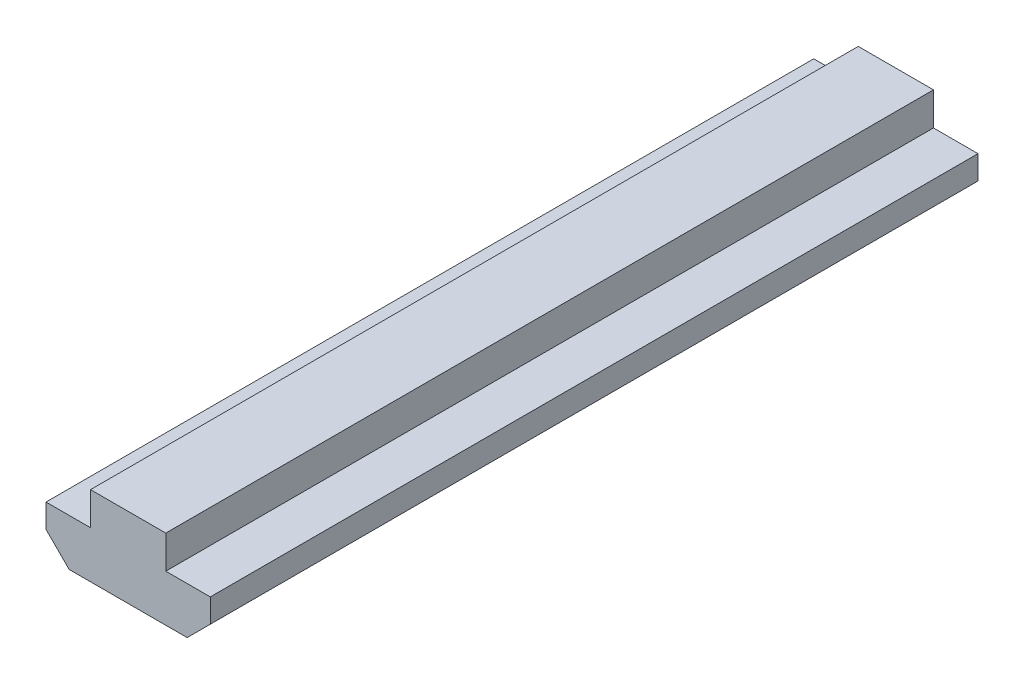
ISO-10303-21;
HEADER;
FILE_DESCRIPTION(('STEP AP214'),'2;1');
FILE_NAME('part.step','',(''),(''),'','','');
FILE_SCHEMA(('AUTOMOTIVE_DESIGN { 1 0 10303 214 1 1 1 1 }'));
ENDSEC;
DATA;
#1=APPLICATION_CONTEXT('core data for automotive mechanical design processes');
#2=APPLICATION_PROTOCOL_DEFINITION('international standard','automotive_design',2000,#1);
#3=PRODUCT_CONTEXT('',#1,'mechanical');
#4=PRODUCT('Part','Part','',(#3));
#5=PRODUCT_RELATED_PRODUCT_CATEGORY('part','',(#4));
#6=PRODUCT_DEFINITION_FORMATION('','',#4);
#7=PRODUCT_DEFINITION_CONTEXT('part definition',#1,'design');
#8=PRODUCT_DEFINITION('design','',#6,#7);
#9=PRODUCT_DEFINITION_SHAPE('','',#8);
#10=(LENGTH_UNIT() NAMED_UNIT(*) SI_UNIT(.MILLI.,.METRE.));
#11=(NAMED_UNIT(*) PLANE_ANGLE_UNIT() SI_UNIT($,.RADIAN.));
#12=(NAMED_UNIT(*) SI_UNIT($,.STERADIAN.) SOLID_ANGLE_UNIT());
#13=UNCERTAINTY_MEASURE_WITH_UNIT(LENGTH_MEASURE(1.E-05),#10,'distance_accuracy_value','');
#14=(GEOMETRIC_REPRESENTATION_CONTEXT(3) GLOBAL_UNCERTAINTY_ASSIGNED_CONTEXT((#13)) GLOBAL_UNIT_ASSIGNED_CONTEXT((#10,
#11,#12)) REPRESENTATION_CONTEXT('',''));
#15=CARTESIAN_POINT('',(0.,0.,0.));
#16=DIRECTION('',(0.,0.,1.));
#17=DIRECTION('',(1.,0.,0.));
#18=AXIS2_PLACEMENT_3D('',#15,#16,#17);
#19=CARTESIAN_POINT('',(5.79999999999973,4.29999999999995,100.));
#20=DIRECTION('',(0.,-1.,0.));
#21=DIRECTION('',(0.,0.,-1.));
#22=AXIS2_PLACEMENT_3D('',#19,#20,#21);
#23=PLANE('',#22);
#24=DIRECTION('',(-1.,0.,0.));
#25=VECTOR('',#24,1.);
#26=CARTESIAN_POINT('',(5.79999999999973,4.29999999999995,0.));
#27=LINE('',#26,#25);
#28=CARTESIAN_POINT('',(15.5999999999999,4.29999999999995,0.));
#29=VERTEX_POINT('',#28);
#30=CARTESIAN_POINT('',(5.79999999999973,4.29999999999995,0.));
#31=VERTEX_POINT('',#30);
#32=EDGE_CURVE('E143',#29,#31,#27,.T.);
#33=ORIENTED_EDGE('',*,*,#32,.T.);
#34=DIRECTION('',(0.,0.,-1.));
#35=VECTOR('',#34,1.);
#36=CARTESIAN_POINT('',(5.79999999999973,4.29999999999995,100.));
#37=LINE('',#36,#35);
#38=CARTESIAN_POINT('',(5.79999999999973,4.29999999999995,100.));
#39=VERTEX_POINT('',#38);
#40=EDGE_CURVE('E11',#39,#31,#37,.T.);
#41=ORIENTED_EDGE('',*,*,#40,.F.);
#42=DIRECTION('',(-1.,0.,0.));
#43=VECTOR('',#42,1.);
#44=CARTESIAN_POINT('',(5.79999999999973,4.29999999999995,100.));
#45=LINE('',#44,#43);
#46=CARTESIAN_POINT('',(15.5999999999999,4.29999999999995,100.));
#47=VERTEX_POINT('',#46);
#48=EDGE_CURVE('E161',#47,#39,#45,.T.);
#49=ORIENTED_EDGE('',*,*,#48,.F.);
#50=DIRECTION('',(0.,0.,-1.));
#51=VECTOR('',#50,1.);
#52=CARTESIAN_POINT('',(15.5999999999999,4.29999999999995,100.));
#53=LINE('',#52,#51);
#54=EDGE_CURVE('E139',#47,#29,#53,.T.);
#55=ORIENTED_EDGE('',*,*,#54,.T.);
#56=EDGE_LOOP('',(#33,#41,#49,#55));
#57=FACE_BOUND('',#56,.T.);
#58=ADVANCED_FACE('F35',(#57),#23,.F.);
#59=CARTESIAN_POINT('',(5.79999999999973,4.29999999999995,100.));
#60=DIRECTION('',(1.,0.,0.));
#61=DIRECTION('',(0.,0.,-1.));
#62=AXIS2_PLACEMENT_3D('',#59,#60,#61);
#63=PLANE('',#62);
#64=DIRECTION('',(0.,-1.,0.));
#65=VECTOR('',#64,1.);
#66=CARTESIAN_POINT('',(5.79999999999973,4.29999999999995,0.));
#67=LINE('',#66,#65);
#68=CARTESIAN_POINT('',(5.79999999999973,0.,0.));
#69=VERTEX_POINT('',#68);
#70=EDGE_CURVE('E146',#31,#69,#67,.T.);
#71=ORIENTED_EDGE('',*,*,#70,.T.);
#72=DIRECTION('',(0.,0.,-1.));
#73=VECTOR('',#72,1.);
#74=CARTESIAN_POINT('',(5.79999999999973,0.,100.));
#75=LINE('',#74,#73);
#76=CARTESIAN_POINT('',(5.79999999999973,0.,100.));
#77=VERTEX_POINT('',#76);
#78=EDGE_CURVE('E43',#77,#69,#75,.T.);
#79=ORIENTED_EDGE('',*,*,#78,.F.);
#80=DIRECTION('',(0.,-1.,0.));
#81=VECTOR('',#80,1.);
#82=CARTESIAN_POINT('',(5.79999999999973,4.29999999999995,100.));
#83=LINE('',#82,#81);
#84=EDGE_CURVE('E100',#39,#77,#83,.T.);
#85=ORIENTED_EDGE('',*,*,#84,.F.);
#86=ORIENTED_EDGE('',*,*,#40,.T.);
#87=EDGE_LOOP('',(#71,#79,#85,#86));
#88=FACE_BOUND('',#87,.T.);
#89=ADVANCED_FACE('F210',(#88),#63,.F.);
#90=CARTESIAN_POINT('',(0.,0.,100.));
#91=DIRECTION('',(0.,-1.,0.));
#92=DIRECTION('',(0.,0.,-1.));
#93=AXIS2_PLACEMENT_3D('',#90,#91,#92);
#94=PLANE('',#93);
#95=DIRECTION('',(-1.,0.,0.));
#96=VECTOR('',#95,1.);
#97=CARTESIAN_POINT('',(0.,0.,0.));
#98=LINE('',#97,#96);
#99=CARTESIAN_POINT('',(0.,0.,0.));
#100=VERTEX_POINT('',#99);
#101=EDGE_CURVE('E148',#69,#100,#98,.T.);
#102=ORIENTED_EDGE('',*,*,#101,.T.);
#103=DIRECTION('',(0.,0.,-1.));
#104=VECTOR('',#103,1.);
#105=CARTESIAN_POINT('',(0.,0.,100.));
#106=LINE('',#105,#104);
#107=CARTESIAN_POINT('',(0.,0.,100.));
#108=VERTEX_POINT('',#107);
#109=EDGE_CURVE('E174',#108,#100,#106,.T.);
#110=ORIENTED_EDGE('',*,*,#109,.F.);
#111=DIRECTION('',(-1.,0.,0.));
#112=VECTOR('',#111,1.);
#113=CARTESIAN_POINT('',(0.,0.,100.));
#114=LINE('',#113,#112);
#115=EDGE_CURVE('E182',#77,#108,#114,.T.);
#116=ORIENTED_EDGE('',*,*,#115,.F.);
#117=ORIENTED_EDGE('',*,*,#78,.T.);
#118=EDGE_LOOP('',(#102,#110,#116,#117));
#119=FACE_BOUND('',#118,.T.);
#120=ADVANCED_FACE('F180',(#119),#94,.F.);
#121=CARTESIAN_POINT('',(0.,-3.08500000000026,100.));
#122=DIRECTION('',(1.,0.,0.));
#123=DIRECTION('',(0.,0.,-1.));
#124=AXIS2_PLACEMENT_3D('',#121,#122,#123);
#125=PLANE('',#124);
#126=DIRECTION('',(0.,-1.,0.));
#127=VECTOR('',#126,1.);
#128=CARTESIAN_POINT('',(0.,-3.08500000000026,0.));
#129=LINE('',#128,#127);
#130=CARTESIAN_POINT('',(0.,-3.08500000000026,0.));
#131=VERTEX_POINT('',#130);
#132=EDGE_CURVE('E150',#100,#131,#129,.T.);
#133=ORIENTED_EDGE('',*,*,#132,.T.);
#134=DIRECTION('',(0.,0.,-1.));
#135=VECTOR('',#134,1.);
#136=CARTESIAN_POINT('',(0.,-3.08500000000026,100.));
#137=LINE('',#136,#135);
#138=CARTESIAN_POINT('',(0.,-3.08500000000026,100.));
#139=VERTEX_POINT('',#138);
#140=EDGE_CURVE('E171',#139,#131,#137,.T.);
#141=ORIENTED_EDGE('',*,*,#140,.F.);
#142=DIRECTION('',(0.,-1.,0.));
#143=VECTOR('',#142,1.);
#144=CARTESIAN_POINT('',(0.,-3.08500000000026,100.));
#145=LINE('',#144,#143);
#146=EDGE_CURVE('E200',#108,#139,#145,.T.);
#147=ORIENTED_EDGE('',*,*,#146,.F.);
#148=ORIENTED_EDGE('',*,*,#109,.T.);
#149=EDGE_LOOP('',(#133,#141,#147,#148));
#150=FACE_BOUND('',#149,.T.);
#151=ADVANCED_FACE('F191',(#150),#125,.F.);
#152=CARTESIAN_POINT('',(3.01499999999987,-6.10000000000002,100.));
#153=DIRECTION('',(0.707106781186534,0.707106781186561,0.));
#154=DIRECTION('',(-0.707106781186561,0.707106781186534,0.));
#155=AXIS2_PLACEMENT_3D('',#152,#153,#154);
#156=PLANE('',#155);
#157=DIRECTION('',(0.707106781186561,-0.707106781186534,0.));
#158=VECTOR('',#157,1.);
#159=CARTESIAN_POINT('',(3.01499999999987,-6.10000000000002,0.));
#160=LINE('',#159,#158);
#161=CARTESIAN_POINT('',(3.01499999999987,-6.10000000000002,0.));
#162=VERTEX_POINT('',#161);
#163=EDGE_CURVE('E152',#131,#162,#160,.T.);
#164=ORIENTED_EDGE('',*,*,#163,.T.);
#165=DIRECTION('',(0.,0.,-1.));
#166=VECTOR('',#165,1.);
#167=CARTESIAN_POINT('',(3.01499999999987,-6.10000000000002,100.));
#168=LINE('',#167,#166);
#169=CARTESIAN_POINT('',(3.01499999999987,-6.10000000000002,100.));
#170=VERTEX_POINT('',#169);
#171=EDGE_CURVE('E168',#170,#162,#168,.T.);
#172=ORIENTED_EDGE('',*,*,#171,.F.);
#173=DIRECTION('',(0.707106781186561,-0.707106781186534,0.));
#174=VECTOR('',#173,1.);
#175=CARTESIAN_POINT('',(3.01499999999987,-6.10000000000002,100.));
#176=LINE('',#175,#174);
#177=EDGE_CURVE('E197',#139,#170,#176,.T.);
#178=ORIENTED_EDGE('',*,*,#177,.F.);
#179=ORIENTED_EDGE('',*,*,#140,.T.);
#180=EDGE_LOOP('',(#164,#172,#178,#179));
#181=FACE_BOUND('',#180,.T.);
#182=ADVANCED_FACE('F195',(#181),#156,.F.);
#183=CARTESIAN_POINT('',(3.01499999999987,-6.10000000000002,100.));
#184=DIRECTION('',(0.,1.,0.));
#185=DIRECTION('',(0.,0.,1.));
#186=AXIS2_PLACEMENT_3D('',#183,#184,#185);
#187=PLANE('',#186);
#188=DIRECTION('',(1.,0.,0.));
#189=VECTOR('',#188,1.);
#190=CARTESIAN_POINT('',(3.01499999999987,-6.10000000000002,0.));
#191=LINE('',#190,#189);
#192=CARTESIAN_POINT('',(18.3849999999998,-6.10000000000002,0.));
#193=VERTEX_POINT('',#192);
#194=EDGE_CURVE('E154',#162,#193,#191,.T.);
#195=ORIENTED_EDGE('',*,*,#194,.T.);
#196=DIRECTION('',(0.,0.,-1.));
#197=VECTOR('',#196,1.);
#198=CARTESIAN_POINT('',(18.3849999999998,-6.10000000000002,100.));
#199=LINE('',#198,#197);
#200=CARTESIAN_POINT('',(18.3849999999998,-6.10000000000002,100.));
#201=VERTEX_POINT('',#200);
#202=EDGE_CURVE('E165',#201,#193,#199,.T.);
#203=ORIENTED_EDGE('',*,*,#202,.F.);
#204=DIRECTION('',(1.,0.,0.));
#205=VECTOR('',#204,1.);
#206=CARTESIAN_POINT('',(3.01499999999987,-6.10000000000002,100.));
#207=LINE('',#206,#205);
#208=EDGE_CURVE('E199',#170,#201,#207,.T.);
#209=ORIENTED_EDGE('',*,*,#208,.F.);
#210=ORIENTED_EDGE('',*,*,#171,.T.);
#211=EDGE_LOOP('',(#195,#203,#209,#210));
#212=FACE_BOUND('',#211,.T.);
#213=ADVANCED_FACE('F222',(#212),#187,.F.);
#214=CARTESIAN_POINT('',(18.3849999999998,-6.10000000000002,100.));
#215=DIRECTION('',(-0.707106781186534,0.707106781186561,0.));
#216=DIRECTION('',(-0.707106781186561,-0.707106781186534,0.));
#217=AXIS2_PLACEMENT_3D('',#214,#215,#216);
#218=PLANE('',#217);
#219=DIRECTION('',(0.707106781186561,0.707106781186534,0.));
#220=VECTOR('',#219,1.);
#221=CARTESIAN_POINT('',(18.3849999999998,-6.10000000000002,0.));
#222=LINE('',#221,#220);
#223=CARTESIAN_POINT('',(21.3999999999996,-3.08500000000026,0.));
#224=VERTEX_POINT('',#223);
#225=EDGE_CURVE('E156',#193,#224,#222,.T.);
#226=ORIENTED_EDGE('',*,*,#225,.T.);
#227=DIRECTION('',(0.,0.,-1.));
#228=VECTOR('',#227,1.);
#229=CARTESIAN_POINT('',(21.3999999999996,-3.08500000000026,100.));
#230=LINE('',#229,#228);
#231=CARTESIAN_POINT('',(21.3999999999996,-3.08500000000026,100.));
#232=VERTEX_POINT('',#231);
#233=EDGE_CURVE('E134',#232,#224,#230,.T.);
#234=ORIENTED_EDGE('',*,*,#233,.F.);
#235=DIRECTION('',(0.707106781186561,0.707106781186534,0.));
#236=VECTOR('',#235,1.);
#237=CARTESIAN_POINT('',(18.3849999999998,-6.10000000000002,100.));
#238=LINE('',#237,#236);
#239=EDGE_CURVE('E125',#201,#232,#238,.T.);
#240=ORIENTED_EDGE('',*,*,#239,.F.);
#241=ORIENTED_EDGE('',*,*,#202,.T.);
#242=EDGE_LOOP('',(#226,#234,#240,#241));
#243=FACE_BOUND('',#242,.T.);
#244=ADVANCED_FACE('F225',(#243),#218,.F.);
#245=CARTESIAN_POINT('',(21.3999999999996,-3.08500000000026,100.));
#246=DIRECTION('',(-1.,0.,0.));
#247=DIRECTION('',(0.,0.,1.));
#248=AXIS2_PLACEMENT_3D('',#245,#246,#247);
#249=PLANE('',#248);
#250=DIRECTION('',(0.,1.,0.));
#251=VECTOR('',#250,1.);
#252=CARTESIAN_POINT('',(21.3999999999996,-3.08500000000026,0.));
#253=LINE('',#252,#251);
#254=CARTESIAN_POINT('',(21.3999999999996,1.13686837721616E-13,0.));
#255=VERTEX_POINT('',#254);
#256=EDGE_CURVE('E133',#224,#255,#253,.T.);
#257=ORIENTED_EDGE('',*,*,#256,.T.);
#258=DIRECTION('',(0.,0.,-1.));
#259=VECTOR('',#258,1.);
#260=CARTESIAN_POINT('',(21.3999999999996,1.13686837721616E-13,100.));
#261=LINE('',#260,#259);
#262=CARTESIAN_POINT('',(21.3999999999996,1.13686837721616E-13,100.));
#263=VERTEX_POINT('',#262);
#264=EDGE_CURVE('E130',#263,#255,#261,.T.);
#265=ORIENTED_EDGE('',*,*,#264,.F.);
#266=DIRECTION('',(0.,1.,0.));
#267=VECTOR('',#266,1.);
#268=CARTESIAN_POINT('',(21.3999999999996,-3.08500000000026,100.));
#269=LINE('',#268,#267);
#270=EDGE_CURVE('E119',#232,#263,#269,.T.);
#271=ORIENTED_EDGE('',*,*,#270,.F.);
#272=ORIENTED_EDGE('',*,*,#233,.T.);
#273=EDGE_LOOP('',(#257,#265,#271,#272));
#274=FACE_BOUND('',#273,.T.);
#275=ADVANCED_FACE('F131',(#274),#249,.F.);
#276=CARTESIAN_POINT('',(15.5999999999999,0.,100.));
#277=DIRECTION('',(0.,-1.,0.));
#278=DIRECTION('',(1.,0.,0.));
#279=AXIS2_PLACEMENT_3D('',#276,#277,#278);
#280=PLANE('',#279);
#281=DIRECTION('',(-1.,0.,0.));
#282=VECTOR('',#281,1.);
#283=CARTESIAN_POINT('',(15.5999999999999,0.,0.));
#284=LINE('',#283,#282);
#285=CARTESIAN_POINT('',(15.5999999999999,0.,0.));
#286=VERTEX_POINT('',#285);
#287=EDGE_CURVE('E86',#255,#286,#284,.T.);
#288=ORIENTED_EDGE('',*,*,#287,.T.);
#289=DIRECTION('',(0.,0.,-1.));
#290=VECTOR('',#289,1.);
#291=CARTESIAN_POINT('',(15.5999999999999,0.,100.));
#292=LINE('',#291,#290);
#293=CARTESIAN_POINT('',(15.5999999999999,0.,100.));
#294=VERTEX_POINT('',#293);
#295=EDGE_CURVE('E135',#294,#286,#292,.T.);
#296=ORIENTED_EDGE('',*,*,#295,.F.);
#297=DIRECTION('',(-1.,0.,0.));
#298=VECTOR('',#297,1.);
#299=CARTESIAN_POINT('',(15.5999999999999,0.,100.));
#300=LINE('',#299,#298);
#301=EDGE_CURVE('E123',#263,#294,#300,.T.);
#302=ORIENTED_EDGE('',*,*,#301,.F.);
#303=ORIENTED_EDGE('',*,*,#264,.T.);
#304=EDGE_LOOP('',(#288,#296,#302,#303));
#305=FACE_BOUND('',#304,.T.);
#306=ADVANCED_FACE('F137',(#305),#280,.F.);
#307=CARTESIAN_POINT('',(15.5999999999999,4.29999999999995,100.));
#308=DIRECTION('',(-1.,0.,0.));
#309=DIRECTION('',(0.,0.,1.));
#310=AXIS2_PLACEMENT_3D('',#307,#308,#309);
#311=PLANE('',#310);
#312=DIRECTION('',(0.,1.,0.));
#313=VECTOR('',#312,1.);
#314=CARTESIAN_POINT('',(15.5999999999999,4.29999999999995,0.));
#315=LINE('',#314,#313);
#316=EDGE_CURVE('E92',#286,#29,#315,.T.);
#317=ORIENTED_EDGE('',*,*,#316,.T.);
#318=ORIENTED_EDGE('',*,*,#54,.F.);
#319=DIRECTION('',(0.,1.,0.));
#320=VECTOR('',#319,1.);
#321=CARTESIAN_POINT('',(15.5999999999999,4.29999999999995,100.));
#322=LINE('',#321,#320);
#323=EDGE_CURVE('E51',#294,#47,#322,.T.);
#324=ORIENTED_EDGE('',*,*,#323,.F.);
#325=ORIENTED_EDGE('',*,*,#295,.T.);
#326=EDGE_LOOP('',(#317,#318,#324,#325));
#327=FACE_BOUND('',#326,.T.);
#328=ADVANCED_FACE('F234',(#327),#311,.F.);
#329=CARTESIAN_POINT('',(0.,0.,100.));
#330=DIRECTION('',(0.,0.,-1.));
#331=DIRECTION('',(-1.,0.,0.));
#332=AXIS2_PLACEMENT_3D('',#329,#330,#331);
#333=PLANE('',#332);
#334=ORIENTED_EDGE('',*,*,#48,.T.);
#335=ORIENTED_EDGE('',*,*,#84,.T.);
#336=ORIENTED_EDGE('',*,*,#115,.T.);
#337=ORIENTED_EDGE('',*,*,#146,.T.);
#338=ORIENTED_EDGE('',*,*,#177,.T.);
#339=ORIENTED_EDGE('',*,*,#208,.T.);
#340=ORIENTED_EDGE('',*,*,#239,.T.);
#341=ORIENTED_EDGE('',*,*,#270,.T.);
#342=ORIENTED_EDGE('',*,*,#301,.T.);
#343=ORIENTED_EDGE('',*,*,#323,.T.);
#344=EDGE_LOOP('',(#334,#335,#336,#337,#338,#339,#340,#341,#342,#343));
#345=FACE_BOUND('',#344,.T.);
#346=ADVANCED_FACE('F121',(#345),#333,.F.);
#347=CARTESIAN_POINT('',(0.,0.,0.));
#348=DIRECTION('',(0.,0.,-1.));
#349=DIRECTION('',(-1.,0.,0.));
#350=AXIS2_PLACEMENT_3D('',#347,#348,#349);
#351=PLANE('',#350);
#352=ORIENTED_EDGE('',*,*,#32,.F.);
#353=ORIENTED_EDGE('',*,*,#316,.F.);
#354=ORIENTED_EDGE('',*,*,#287,.F.);
#355=ORIENTED_EDGE('',*,*,#256,.F.);
#356=ORIENTED_EDGE('',*,*,#225,.F.);
#357=ORIENTED_EDGE('',*,*,#194,.F.);
#358=ORIENTED_EDGE('',*,*,#163,.F.);
#359=ORIENTED_EDGE('',*,*,#132,.F.);
#360=ORIENTED_EDGE('',*,*,#101,.F.);
#361=ORIENTED_EDGE('',*,*,#70,.F.);
#362=EDGE_LOOP('',(#352,#353,#354,#355,#356,#357,#358,#359,#360,#361));
#363=FACE_BOUND('',#362,.T.);
#364=ADVANCED_FACE('F186',(#363),#351,.T.);
#365=CLOSED_SHELL('',(#58,#89,#120,#151,#182,#213,#244,#275,#306,#328,#346,#364));
#366=MANIFOLD_SOLID_BREP('B2',#365);
#367=ADVANCED_BREP_SHAPE_REPRESENTATION('',(#18,#366),#14);
#368=SHAPE_DEFINITION_REPRESENTATION(#9,#367);
ENDSEC;
END-ISO-10303-21;
